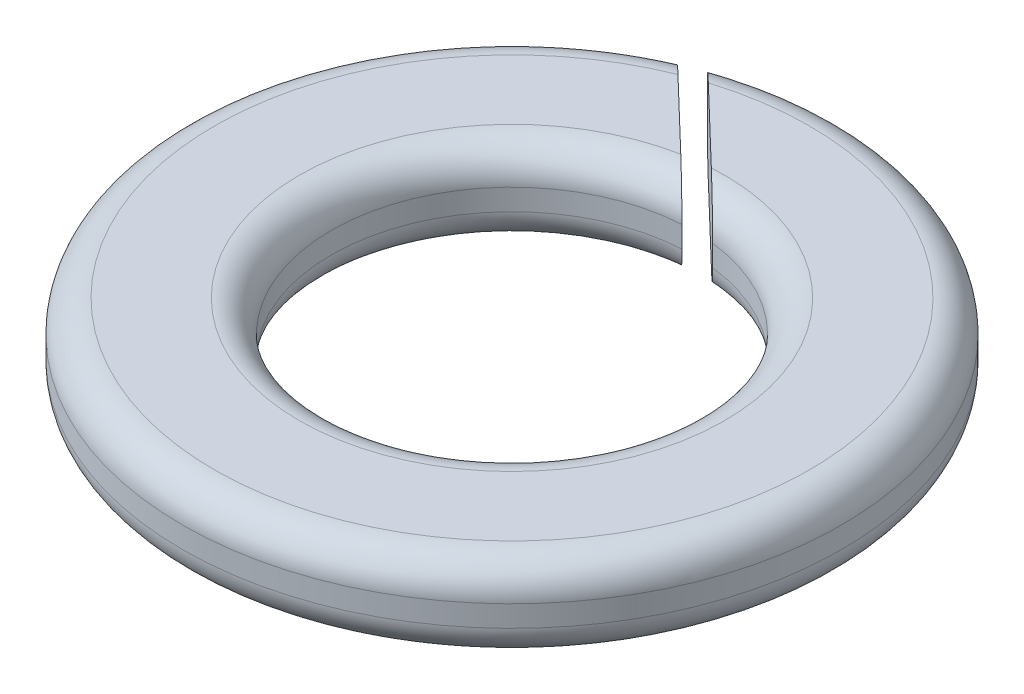
ISO-10303-21;
HEADER;
FILE_DESCRIPTION(('STEP AP214'),'2;1');
FILE_NAME('part.step','',(''),(''),'','','');
FILE_SCHEMA(('AUTOMOTIVE_DESIGN { 1 0 10303 214 1 1 1 1 }'));
ENDSEC;
DATA;
#1=APPLICATION_CONTEXT('core data for automotive mechanical design processes');
#2=APPLICATION_PROTOCOL_DEFINITION('international standard','automotive_design',2000,#1);
#3=PRODUCT_CONTEXT('',#1,'mechanical');
#4=PRODUCT('Part','Part','',(#3));
#5=PRODUCT_RELATED_PRODUCT_CATEGORY('part','',(#4));
#6=PRODUCT_DEFINITION_FORMATION('','',#4);
#7=PRODUCT_DEFINITION_CONTEXT('part definition',#1,'design');
#8=PRODUCT_DEFINITION('design','',#6,#7);
#9=PRODUCT_DEFINITION_SHAPE('','',#8);
#10=(LENGTH_UNIT() NAMED_UNIT(*) SI_UNIT(.MILLI.,.METRE.));
#11=(NAMED_UNIT(*) PLANE_ANGLE_UNIT() SI_UNIT($,.RADIAN.));
#12=(NAMED_UNIT(*) SI_UNIT($,.STERADIAN.) SOLID_ANGLE_UNIT());
#13=UNCERTAINTY_MEASURE_WITH_UNIT(LENGTH_MEASURE(1.E-05),#10,'distance_accuracy_value','');
#14=(GEOMETRIC_REPRESENTATION_CONTEXT(3) GLOBAL_UNCERTAINTY_ASSIGNED_CONTEXT((#13)) GLOBAL_UNIT_ASSIGNED_CONTEXT((#10,
#11,#12)) REPRESENTATION_CONTEXT('',''));
#15=CARTESIAN_POINT('',(0.,0.,0.));
#16=DIRECTION('',(0.,0.,1.));
#17=DIRECTION('',(1.,0.,0.));
#18=AXIS2_PLACEMENT_3D('',#15,#16,#17);
#19=CARTESIAN_POINT('',(0.59332221783792,0.,-1.03286101617911));
#20=DIRECTION('',(-0.69253182818971,0.,0.721387321030955));
#21=DIRECTION('',(0.,1.,0.));
#22=AXIS2_PLACEMENT_3D('',#19,#20,#21);
#23=PLANE('',#22);
#24=CARTESIAN_POINT('',(-0.0986312795081726,0.3,-1.69713637363135));
#25=CARTESIAN_POINT('',(-0.0986312795081726,0.234261707089902,-1.69713637363135));
#26=CARTESIAN_POINT('',(-0.126426150293096,0.17248439131002,-1.72381944958488));
#27=CARTESIAN_POINT('',(-0.150435796847258,0.119120174278137,-1.74686871027687));
#28=CARTESIAN_POINT('',(-0.194142012840885,0.0769933912338224,-1.78882667763076));
#29=CARTESIAN_POINT('',(-0.232756500511855,0.0397743342301334,-1.82589658579489));
#30=CARTESIAN_POINT('',(-0.281431631578214,0.0193027566863617,-1.87262471161859));
#31=CARTESIAN_POINT('',(-0.327327665220066,0.,-1.91668490391477));
#32=CARTESIAN_POINT('',(-0.376805566578946,0.,-1.96418368921929));
#33=B_SPLINE_CURVE_WITH_KNOTS('',2,(#24,#25,#26,#27,#28,#29,#30,#31,#32),.UNSPECIFIED.,.F.,.F.,
(3,2,2,2,3),(0.,0.25,0.5,0.75,1.),.UNSPECIFIED.);
#34=CARTESIAN_POINT('',(-0.0986312795081722,0.3,-1.69713637363135));
#35=VERTEX_POINT('',#34);
#36=CARTESIAN_POINT('',(-0.376805566578947,0.,-1.96418368921929));
#37=VERTEX_POINT('',#36);
#38=EDGE_CURVE('E103',#35,#37,#33,.T.);
#39=ORIENTED_EDGE('',*,*,#38,.T.);
#40=DIRECTION('',(0.721387321030955,0.,0.69253182818971));
#41=VECTOR('',#40,1.);
#42=CARTESIAN_POINT('',(0.59332221783792,0.,-1.03286101617911));
#43=LINE('',#42,#41);
#44=CARTESIAN_POINT('',(-1.03914839905561,0.,-2.60003280839688));
#45=VERTEX_POINT('',#44);
#46=EDGE_CURVE('E244',#45,#37,#43,.T.);
#47=ORIENTED_EDGE('',*,*,#46,.F.);
#48=CARTESIAN_POINT('',(-1.0391483990556,0.,-2.60003280839688));
#49=CARTESIAN_POINT('',(-1.08375186864959,0.,-2.64285213920711));
#50=CARTESIAN_POINT('',(-1.12612194940744,0.0210135532436115,-2.68352741673464));
#51=CARTESIAN_POINT('',(-1.16802810861543,0.0417970233716311,-2.72375732957431));
#52=CARTESIAN_POINT('',(-1.20204748947529,0.082967884148672,-2.75641593519978));
#53=CARTESIAN_POINT('',(-1.23532379855897,0.123239466224237,-2.78836119192011));
#54=CARTESIAN_POINT('',(-1.25500707685527,0.180829093114497,-2.80725713908455));
#55=CARTESIAN_POINT('',(-1.27444248817979,0.2376935071511,-2.8259151339561));
#56=CARTESIAN_POINT('',(-1.27444248817979,0.3,-2.8259151339561));
#57=B_SPLINE_CURVE_WITH_KNOTS('',2,(#48,#49,#50,#51,#52,#53,#54,#55,#56),.UNSPECIFIED.,.F.,.F.,
(3,2,2,2,3),(0.,0.25,0.5,0.75,1.),.UNSPECIFIED.);
#58=CARTESIAN_POINT('',(-1.27444248817979,0.3,-2.82591513395609));
#59=VERTEX_POINT('',#58);
#60=EDGE_CURVE('E240',#45,#59,#57,.T.);
#61=ORIENTED_EDGE('',*,*,#60,.T.);
#62=DIRECTION('',(0.,-1.,0.));
#63=VECTOR('',#62,1.);
#64=CARTESIAN_POINT('',(-1.27444248817979,0.8,-2.82591513395609));
#65=LINE('',#64,#63);
#66=CARTESIAN_POINT('',(-1.27444248817979,0.5,-2.82591513395609));
#67=VERTEX_POINT('',#66);
#68=EDGE_CURVE('E295',#67,#59,#65,.T.);
#69=ORIENTED_EDGE('',*,*,#68,.F.);
#70=CARTESIAN_POINT('',(-1.27444248817979,0.5,-2.8259151339561));
#71=CARTESIAN_POINT('',(-1.27444248817979,0.560676392765255,-2.8259151339561));
#72=CARTESIAN_POINT('',(-1.25490181711963,0.619217893111312,-2.80715608973835));
#73=CARTESIAN_POINT('',(-1.23642127788555,0.674583366008184,-2.78941477207362));
#74=CARTESIAN_POINT('',(-1.20218104383385,0.7168688855888,-2.75654414738399));
#75=CARTESIAN_POINT('',(-1.17024585829597,0.756307748983645,-2.72588636926763));
#76=CARTESIAN_POINT('',(-1.12631642022314,0.778726915178642,-2.68371410871771));
#77=CARTESIAN_POINT('',(-1.08463268166884,0.8,-2.64369771970558));
#78=CARTESIAN_POINT('',(-1.0391483990556,0.8,-2.60003280839688));
#79=B_SPLINE_CURVE_WITH_KNOTS('',2,(#70,#71,#72,#73,#74,#75,#76,#77,#78),.UNSPECIFIED.,.F.,.F.,
(3,2,2,2,3),(0.,0.25,0.5,0.75,1.),.UNSPECIFIED.);
#80=CARTESIAN_POINT('',(-1.03914839905561,0.8,-2.60003280839688));
#81=VERTEX_POINT('',#80);
#82=EDGE_CURVE('E31',#67,#81,#79,.T.);
#83=ORIENTED_EDGE('',*,*,#82,.T.);
#84=DIRECTION('',(0.721387321030955,0.,0.69253182818971));
#85=VECTOR('',#84,1.);
#86=CARTESIAN_POINT('',(0.59332221783792,0.8,-1.03286101617911));
#87=LINE('',#86,#85);
#88=CARTESIAN_POINT('',(-0.376805566578947,0.8,-1.96418368921929));
#89=VERTEX_POINT('',#88);
#90=EDGE_CURVE('E278',#81,#89,#87,.T.);
#91=ORIENTED_EDGE('',*,*,#90,.T.);
#92=CARTESIAN_POINT('',(-0.376805566578946,0.8,-1.96418368921929));
#93=CARTESIAN_POINT('',(-0.328449770253191,0.8,-1.91776212474657));
#94=CARTESIAN_POINT('',(-0.281368571475747,0.780666625655912,-1.87256417392022));
#95=CARTESIAN_POINT('',(-0.234754133030916,0.761524921287816,-1.82781431301319));
#96=CARTESIAN_POINT('',(-0.194116225611434,0.722981956170114,-1.78880192189048));
#97=CARTESIAN_POINT('',(-0.152042471220537,0.68307716404783,-1.74841111767522));
#98=CARTESIAN_POINT('',(-0.126416351695923,0.627494101989317,-1.72381004293159));
#99=CARTESIAN_POINT('',(-0.0986312795081733,0.567228270862273,-1.69713637363135));
#100=CARTESIAN_POINT('',(-0.0986312795081733,0.5,-1.69713637363135));
#101=B_SPLINE_CURVE_WITH_KNOTS('',2,(#92,#93,#94,#95,#96,#97,#98,#99,#100),.UNSPECIFIED.,.F.,
.F.,(3,2,2,2,3),(0.,0.25,0.5,0.75,1.),.UNSPECIFIED.);
#102=CARTESIAN_POINT('',(-0.0986312795081731,0.5,-1.69713637363135));
#103=VERTEX_POINT('',#102);
#104=EDGE_CURVE('E94',#89,#103,#101,.T.);
#105=ORIENTED_EDGE('',*,*,#104,.T.);
#106=DIRECTION('',(0.,-1.,0.));
#107=VECTOR('',#106,1.);
#108=CARTESIAN_POINT('',(-0.0986312795081722,0.8,-1.69713637363135));
#109=LINE('',#108,#107);
#110=EDGE_CURVE('E119',#103,#35,#109,.T.);
#111=ORIENTED_EDGE('',*,*,#110,.T.);
#112=EDGE_LOOP('',(#39,#47,#61,#69,#83,#91,#105,#111));
#113=FACE_BOUND('',#112,.T.);
#114=ADVANCED_FACE('F17',(#113),#23,.F.);
#115=CARTESIAN_POINT('',(0.731828583475849,0.,-1.17713848038529));
#116=DIRECTION('',(0.692531828189712,0.,-0.721387321030953));
#117=DIRECTION('',(0.,-1.,0.));
#118=AXIS2_PLACEMENT_3D('',#115,#116,#117);
#119=PLANE('',#118);
#120=CARTESIAN_POINT('',(-0.121472675484778,0.,-1.99630768898749));
#121=CARTESIAN_POINT('',(-0.0125474432038187,0.,-1.89173946599777));
#122=CARTESIAN_POINT('',(0.0803852052940784,0.0726068632668492,-1.80252412343979));
#123=CARTESIAN_POINT('',(0.130013637964348,0.11138080206318,-1.75488082807633));
#124=CARTESIAN_POINT('',(0.161760835648689,0.165233228507731,-1.72440351829936));
#125=CARTESIAN_POINT('',(0.199405517542557,0.229089493330691,-1.68826462368125));
#126=CARTESIAN_POINT('',(0.199405517542557,0.3,-1.68826462368125));
#127=B_SPLINE_CURVE_WITH_KNOTS('',2,(#120,#121,#122,#123,#124,#125,#126),.UNSPECIFIED.,.F.,.F.,
(3,2,2,3),(0.,0.5,0.75,1.),.UNSPECIFIED.);
#128=CARTESIAN_POINT('',(-0.121472675484779,0.,-1.99630768898749));
#129=VERTEX_POINT('',#128);
#130=CARTESIAN_POINT('',(0.199405517542557,0.3,-1.68826462368125));
#131=VERTEX_POINT('',#130);
#132=EDGE_CURVE('E45',#129,#131,#127,.T.);
#133=ORIENTED_EDGE('',*,*,#132,.T.);
#134=DIRECTION('',(0.,1.,0.));
#135=VECTOR('',#134,1.);
#136=CARTESIAN_POINT('',(0.199405517542557,0.8,-1.68826462368125));
#137=LINE('',#136,#135);
#138=CARTESIAN_POINT('',(0.199405517542554,0.5,-1.68826462368125));
#139=VERTEX_POINT('',#138);
#140=EDGE_CURVE('E120',#131,#139,#137,.T.);
#141=ORIENTED_EDGE('',*,*,#140,.T.);
#142=CARTESIAN_POINT('',(0.199405517542554,0.5,-1.68826462368125));
#143=CARTESIAN_POINT('',(0.199405517542554,0.569265093277831,-1.68826462368125));
#144=CARTESIAN_POINT('',(0.161908947609087,0.634512449141597,-1.72426133081738));
#145=CARTESIAN_POINT('',(0.132161041993242,0.686276442151163,-1.75281932020859));
#146=CARTESIAN_POINT('',(0.0806108764795789,0.727215389554212,-1.80230747910171));
#147=CARTESIAN_POINT('',(-0.0110392257662956,0.8,-1.89029157725775));
#148=CARTESIAN_POINT('',(-0.121472675484778,0.8,-1.99630768898749));
#149=B_SPLINE_CURVE_WITH_KNOTS('',2,(#142,#143,#144,#145,#146,#147,#148),.UNSPECIFIED.,.F.,.F.,
(3,2,2,3),(0.,0.25,0.5,1.),.UNSPECIFIED.);
#150=CARTESIAN_POINT('',(-0.121472675484779,0.8,-1.99630768898749));
#151=VERTEX_POINT('',#150);
#152=EDGE_CURVE('E255',#139,#151,#149,.T.);
#153=ORIENTED_EDGE('',*,*,#152,.T.);
#154=DIRECTION('',(-0.721387321030953,0.,-0.692531828189713));
#155=VECTOR('',#154,1.);
#156=CARTESIAN_POINT('',(0.731828583475849,0.8,-1.17713848038529));
#157=LINE('',#156,#155);
#158=CARTESIAN_POINT('',(-0.828157600833809,0.8,-2.67472521732255));
#159=VERTEX_POINT('',#158);
#160=EDGE_CURVE('E198',#151,#159,#157,.T.);
#161=ORIENTED_EDGE('',*,*,#160,.T.);
#162=CARTESIAN_POINT('',(-0.828157600833808,0.8,-2.67472521732255));
#163=CARTESIAN_POINT('',(-0.924854119020311,0.8,-2.7675538747816));
#164=CARTESIAN_POINT('',(-0.995402103846813,0.719092260090397,-2.83527994021504));
#165=CARTESIAN_POINT('',(-1.03027280667007,0.679100901564312,-2.86875581492537));
#166=CARTESIAN_POINT('',(-1.05114663540912,0.621117871259449,-2.88879469051485));
#167=CARTESIAN_POINT('',(-1.07195051976307,0.563329131491862,-2.90876641949464));
#168=CARTESIAN_POINT('',(-1.07195051976307,0.5,-2.90876641949464));
#169=B_SPLINE_CURVE_WITH_KNOTS('',2,(#162,#163,#164,#165,#166,#167,#168),.UNSPECIFIED.,.F.,.F.,
(3,2,2,3),(0.,0.5,0.75,1.),.UNSPECIFIED.);
#170=CARTESIAN_POINT('',(-1.07195051976307,0.5,-2.90876641949464));
#171=VERTEX_POINT('',#170);
#172=EDGE_CURVE('E11',#159,#171,#169,.T.);
#173=ORIENTED_EDGE('',*,*,#172,.T.);
#174=DIRECTION('',(0.,1.,0.));
#175=VECTOR('',#174,1.);
#176=CARTESIAN_POINT('',(-1.07195051976307,0.8,-2.90876641949464));
#177=LINE('',#176,#175);
#178=CARTESIAN_POINT('',(-1.07195051976307,0.3,-2.90876641949464));
#179=VERTEX_POINT('',#178);
#180=EDGE_CURVE('E125',#179,#171,#177,.T.);
#181=ORIENTED_EDGE('',*,*,#180,.F.);
#182=CARTESIAN_POINT('',(-1.07195051976307,0.3,-2.90876641949464));
#183=CARTESIAN_POINT('',(-1.07195051976307,0.23836451306141,-2.90876641949464));
#184=CARTESIAN_POINT('',(-1.05111633230005,0.17900229265239,-2.88876559953014));
#185=CARTESIAN_POINT('',(-1.03155070958416,0.123254555421846,-2.86998260172289));
#186=CARTESIAN_POINT('',(-0.995635296389774,0.0811779320684331,-2.83550380505628));
#187=CARTESIAN_POINT('',(-0.926344114252497,0.,-2.7689842702045));
#188=CARTESIAN_POINT('',(-0.828157600833808,0.,-2.67472521732255));
#189=B_SPLINE_CURVE_WITH_KNOTS('',2,(#182,#183,#184,#185,#186,#187,#188),.UNSPECIFIED.,.F.,.F.,
(3,2,2,3),(0.,0.25,0.5,1.),.UNSPECIFIED.);
#190=CARTESIAN_POINT('',(-0.828157600833809,0.,-2.67472521732255));
#191=VERTEX_POINT('',#190);
#192=EDGE_CURVE('E307',#179,#191,#189,.T.);
#193=ORIENTED_EDGE('',*,*,#192,.T.);
#194=DIRECTION('',(-0.721387321030953,0.,-0.692531828189713));
#195=VECTOR('',#194,1.);
#196=CARTESIAN_POINT('',(0.731828583475849,0.,-1.17713848038529));
#197=LINE('',#196,#195);
#198=EDGE_CURVE('E296',#129,#191,#197,.T.);
#199=ORIENTED_EDGE('',*,*,#198,.F.);
#200=EDGE_LOOP('',(#133,#141,#153,#161,#173,#181,#193,#199));
#201=FACE_BOUND('',#200,.T.);
#202=ADVANCED_FACE('F19',(#201),#119,.F.);
#203=CARTESIAN_POINT('',(0.,0.5,0.));
#204=DIRECTION('',(0.,1.,0.));
#205=DIRECTION('',(0.,0.,1.));
#206=AXIS2_PLACEMENT_3D('',#203,#204,#205);
#207=TOROIDAL_SURFACE('',#206,2.8,0.3);
#208=ORIENTED_EDGE('',*,*,#82,.F.);
#209=CARTESIAN_POINT('',(0.,0.5,0.));
#210=DIRECTION('',(0.,-1.,0.));
#211=DIRECTION('',(0.,0.,1.));
#212=AXIS2_PLACEMENT_3D('',#209,#210,#211);
#213=CIRCLE('',#212,3.1);
#214=EDGE_CURVE('E291',#171,#67,#213,.T.);
#215=ORIENTED_EDGE('',*,*,#214,.F.);
#216=ORIENTED_EDGE('',*,*,#172,.F.);
#217=CARTESIAN_POINT('',(0.,0.8,0.));
#218=DIRECTION('',(0.,1.,0.));
#219=DIRECTION('',(0.,0.,1.));
#220=AXIS2_PLACEMENT_3D('',#217,#218,#219);
#221=CIRCLE('',#220,2.8);
#222=EDGE_CURVE('E272',#81,#159,#221,.T.);
#223=ORIENTED_EDGE('',*,*,#222,.F.);
#224=EDGE_LOOP('',(#208,#215,#216,#223));
#225=FACE_BOUND('',#224,.T.);
#226=ADVANCED_FACE('F166',(#225),#207,.T.);
#227=CARTESIAN_POINT('',(0.,0.3,0.));
#228=DIRECTION('',(0.,1.,0.));
#229=DIRECTION('',(0.,0.,1.));
#230=AXIS2_PLACEMENT_3D('',#227,#228,#229);
#231=TOROIDAL_SURFACE('',#230,2.8,0.3);
#232=ORIENTED_EDGE('',*,*,#60,.F.);
#233=CARTESIAN_POINT('',(0.,0.,0.));
#234=DIRECTION('',(0.,-1.,0.));
#235=DIRECTION('',(0.,0.,1.));
#236=AXIS2_PLACEMENT_3D('',#233,#234,#235);
#237=CIRCLE('',#236,2.8);
#238=EDGE_CURVE('E197',#191,#45,#237,.T.);
#239=ORIENTED_EDGE('',*,*,#238,.F.);
#240=ORIENTED_EDGE('',*,*,#192,.F.);
#241=CARTESIAN_POINT('',(0.,0.3,0.));
#242=DIRECTION('',(0.,1.,0.));
#243=DIRECTION('',(0.,0.,1.));
#244=AXIS2_PLACEMENT_3D('',#241,#242,#243);
#245=CIRCLE('',#244,3.1);
#246=EDGE_CURVE('E134',#59,#179,#245,.T.);
#247=ORIENTED_EDGE('',*,*,#246,.F.);
#248=EDGE_LOOP('',(#232,#239,#240,#247));
#249=FACE_BOUND('',#248,.T.);
#250=ADVANCED_FACE('F172',(#249),#231,.T.);
#251=CARTESIAN_POINT('',(0.,0.5,0.));
#252=DIRECTION('',(0.,1.,0.));
#253=DIRECTION('',(0.,0.,1.));
#254=AXIS2_PLACEMENT_3D('',#251,#252,#253);
#255=TOROIDAL_SURFACE('',#254,2.,0.3);
#256=ORIENTED_EDGE('',*,*,#104,.F.);
#257=CARTESIAN_POINT('',(0.,0.8,0.));
#258=DIRECTION('',(0.,-1.,0.));
#259=DIRECTION('',(0.,0.,1.));
#260=AXIS2_PLACEMENT_3D('',#257,#258,#259);
#261=CIRCLE('',#260,2.);
#262=EDGE_CURVE('E193',#151,#89,#261,.T.);
#263=ORIENTED_EDGE('',*,*,#262,.F.);
#264=ORIENTED_EDGE('',*,*,#152,.F.);
#265=CARTESIAN_POINT('',(0.,0.5,0.));
#266=DIRECTION('',(0.,1.,0.));
#267=DIRECTION('',(0.,0.,1.));
#268=AXIS2_PLACEMENT_3D('',#265,#266,#267);
#269=CIRCLE('',#268,1.7);
#270=EDGE_CURVE('E124',#103,#139,#269,.T.);
#271=ORIENTED_EDGE('',*,*,#270,.F.);
#272=EDGE_LOOP('',(#256,#263,#264,#271));
#273=FACE_BOUND('',#272,.T.);
#274=ADVANCED_FACE('F165',(#273),#255,.T.);
#275=CARTESIAN_POINT('',(0.,0.3,0.));
#276=DIRECTION('',(0.,1.,0.));
#277=DIRECTION('',(0.,0.,1.));
#278=AXIS2_PLACEMENT_3D('',#275,#276,#277);
#279=TOROIDAL_SURFACE('',#278,2.,0.3);
#280=ORIENTED_EDGE('',*,*,#38,.F.);
#281=CARTESIAN_POINT('',(0.,0.3,0.));
#282=DIRECTION('',(0.,-1.,0.));
#283=DIRECTION('',(0.,0.,1.));
#284=AXIS2_PLACEMENT_3D('',#281,#282,#283);
#285=CIRCLE('',#284,1.7);
#286=EDGE_CURVE('E106',#131,#35,#285,.T.);
#287=ORIENTED_EDGE('',*,*,#286,.F.);
#288=ORIENTED_EDGE('',*,*,#132,.F.);
#289=CARTESIAN_POINT('',(0.,0.,0.));
#290=DIRECTION('',(0.,1.,0.));
#291=DIRECTION('',(0.,0.,1.));
#292=AXIS2_PLACEMENT_3D('',#289,#290,#291);
#293=CIRCLE('',#292,2.);
#294=EDGE_CURVE('E109',#37,#129,#293,.T.);
#295=ORIENTED_EDGE('',*,*,#294,.F.);
#296=EDGE_LOOP('',(#280,#287,#288,#295));
#297=FACE_BOUND('',#296,.T.);
#298=ADVANCED_FACE('F105',(#297),#279,.T.);
#299=CARTESIAN_POINT('',(0.,0.8,0.));
#300=DIRECTION('',(0.,-1.,0.));
#301=DIRECTION('',(0.,0.,-1.));
#302=AXIS2_PLACEMENT_3D('',#299,#300,#301);
#303=CYLINDRICAL_SURFACE('',#302,1.7);
#304=ORIENTED_EDGE('',*,*,#110,.F.);
#305=ORIENTED_EDGE('',*,*,#270,.T.);
#306=ORIENTED_EDGE('',*,*,#140,.F.);
#307=ORIENTED_EDGE('',*,*,#286,.T.);
#308=EDGE_LOOP('',(#304,#305,#306,#307));
#309=FACE_BOUND('',#308,.T.);
#310=ADVANCED_FACE('F117',(#309),#303,.F.);
#311=CARTESIAN_POINT('',(0.,0.8,0.));
#312=DIRECTION('',(0.,-1.,0.));
#313=DIRECTION('',(0.,0.,-1.));
#314=AXIS2_PLACEMENT_3D('',#311,#312,#313);
#315=CYLINDRICAL_SURFACE('',#314,3.1);
#316=ORIENTED_EDGE('',*,*,#214,.T.);
#317=ORIENTED_EDGE('',*,*,#68,.T.);
#318=ORIENTED_EDGE('',*,*,#246,.T.);
#319=ORIENTED_EDGE('',*,*,#180,.T.);
#320=EDGE_LOOP('',(#316,#317,#318,#319));
#321=FACE_BOUND('',#320,.T.);
#322=ADVANCED_FACE('F215',(#321),#315,.T.);
#323=CARTESIAN_POINT('',(0.,0.,0.));
#324=DIRECTION('',(0.,1.,0.));
#325=DIRECTION('',(1.,0.,0.));
#326=AXIS2_PLACEMENT_3D('',#323,#324,#325);
#327=PLANE('',#326);
#328=ORIENTED_EDGE('',*,*,#238,.T.);
#329=ORIENTED_EDGE('',*,*,#46,.T.);
#330=ORIENTED_EDGE('',*,*,#294,.T.);
#331=ORIENTED_EDGE('',*,*,#198,.T.);
#332=EDGE_LOOP('',(#328,#329,#330,#331));
#333=FACE_BOUND('',#332,.T.);
#334=ADVANCED_FACE('F213',(#333),#327,.F.);
#335=CARTESIAN_POINT('',(0.,0.8,0.));
#336=DIRECTION('',(0.,1.,0.));
#337=DIRECTION('',(1.,0.,0.));
#338=AXIS2_PLACEMENT_3D('',#335,#336,#337);
#339=PLANE('',#338);
#340=ORIENTED_EDGE('',*,*,#90,.F.);
#341=ORIENTED_EDGE('',*,*,#222,.T.);
#342=ORIENTED_EDGE('',*,*,#160,.F.);
#343=ORIENTED_EDGE('',*,*,#262,.T.);
#344=EDGE_LOOP('',(#340,#341,#342,#343));
#345=FACE_BOUND('',#344,.T.);
#346=ADVANCED_FACE('F270',(#345),#339,.T.);
#347=CLOSED_SHELL('',(#114,#202,#226,#250,#274,#298,#310,#322,#334,#346));
#348=MANIFOLD_SOLID_BREP('B1',#347);
#349=ADVANCED_BREP_SHAPE_REPRESENTATION('',(#18,#348),#14);
#350=SHAPE_DEFINITION_REPRESENTATION(#9,#349);
ENDSEC;
END-ISO-10303-21;
